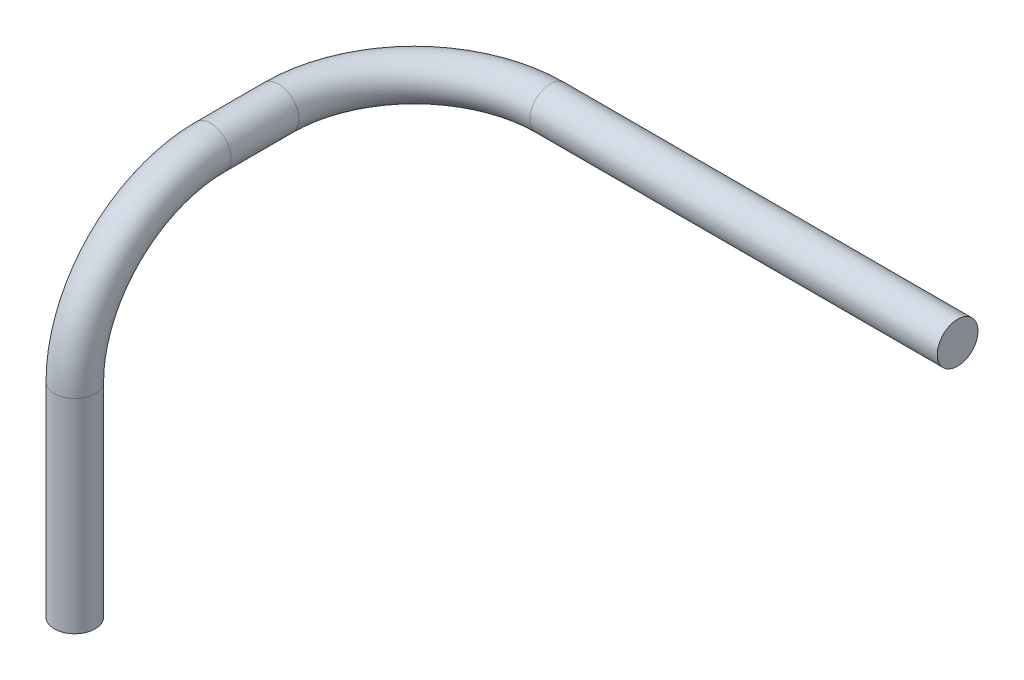
ISO-10303-21;
HEADER;
FILE_DESCRIPTION(('STEP AP214'),'2;1');
FILE_NAME('part.step','',(''),(''),'','','');
FILE_SCHEMA(('AUTOMOTIVE_DESIGN { 1 0 10303 214 1 1 1 1 }'));
ENDSEC;
DATA;
#1=APPLICATION_CONTEXT('core data for automotive mechanical design processes');
#2=APPLICATION_PROTOCOL_DEFINITION('international standard','automotive_design',2000,#1);
#3=PRODUCT_CONTEXT('',#1,'mechanical');
#4=PRODUCT('Part','Part','',(#3));
#5=PRODUCT_RELATED_PRODUCT_CATEGORY('part','',(#4));
#6=PRODUCT_DEFINITION_FORMATION('','',#4);
#7=PRODUCT_DEFINITION_CONTEXT('part definition',#1,'design');
#8=PRODUCT_DEFINITION('design','',#6,#7);
#9=PRODUCT_DEFINITION_SHAPE('','',#8);
#10=(LENGTH_UNIT() NAMED_UNIT(*) SI_UNIT(.MILLI.,.METRE.));
#11=(NAMED_UNIT(*) PLANE_ANGLE_UNIT() SI_UNIT($,.RADIAN.));
#12=(NAMED_UNIT(*) SI_UNIT($,.STERADIAN.) SOLID_ANGLE_UNIT());
#13=UNCERTAINTY_MEASURE_WITH_UNIT(LENGTH_MEASURE(1.E-05),#10,'distance_accuracy_value','');
#14=(GEOMETRIC_REPRESENTATION_CONTEXT(3) GLOBAL_UNCERTAINTY_ASSIGNED_CONTEXT((#13)) GLOBAL_UNIT_ASSIGNED_CONTEXT((#10,
#11,#12)) REPRESENTATION_CONTEXT('',''));
#15=CARTESIAN_POINT('',(0.,0.,0.));
#16=DIRECTION('',(0.,0.,1.));
#17=DIRECTION('',(1.,0.,0.));
#18=AXIS2_PLACEMENT_3D('',#15,#16,#17);
#19=CARTESIAN_POINT('',(0.,0.,0.));
#20=DIRECTION('',(0.,-1.,0.));
#21=DIRECTION('',(1.,0.,0.));
#22=AXIS2_PLACEMENT_3D('',#19,#20,#21);
#23=PLANE('',#22);
#24=CARTESIAN_POINT('',(0.,0.,0.));
#25=DIRECTION('',(0.,-1.,0.));
#26=DIRECTION('',(1.,0.,0.));
#27=AXIS2_PLACEMENT_3D('',#24,#25,#26);
#28=CIRCLE('',#27,1.5);
#29=CARTESIAN_POINT('',(1.5,0.,0.));
#30=VERTEX_POINT('',#29);
#31=EDGE_CURVE('E57',#30,#30,#28,.T.);
#32=ORIENTED_EDGE('',*,*,#31,.T.);
#33=EDGE_LOOP('',(#32));
#34=FACE_BOUND('',#33,.T.);
#35=ADVANCED_FACE('F45',(#34),#23,.T.);
#36=CARTESIAN_POINT('',(40.,25.,-25.));
#37=DIRECTION('',(-1.,0.,0.));
#38=DIRECTION('',(0.,0.,1.));
#39=AXIS2_PLACEMENT_3D('',#36,#37,#38);
#40=PLANE('',#39);
#41=CARTESIAN_POINT('',(40.,25.,-25.));
#42=DIRECTION('',(-1.,0.,0.));
#43=DIRECTION('',(0.,0.,1.));
#44=AXIS2_PLACEMENT_3D('',#41,#42,#43);
#45=CIRCLE('',#44,1.5);
#46=CARTESIAN_POINT('',(40.,25.,-23.5));
#47=VERTEX_POINT('',#46);
#48=EDGE_CURVE('E12',#47,#47,#45,.T.);
#49=ORIENTED_EDGE('',*,*,#48,.F.);
#50=EDGE_LOOP('',(#49));
#51=FACE_BOUND('',#50,.T.);
#52=ADVANCED_FACE('F63',(#51),#40,.F.);
#53=CARTESIAN_POINT('',(0.,0.,0.));
#54=DIRECTION('',(0.,1.,0.));
#55=DIRECTION('',(0.,0.,1.));
#56=AXIS2_PLACEMENT_3D('',#53,#54,#55);
#57=CYLINDRICAL_SURFACE('',#56,1.5);
#58=CARTESIAN_POINT('',(0.,15.,0.));
#59=DIRECTION('',(0.,-1.,0.));
#60=DIRECTION('',(1.,0.,0.));
#61=AXIS2_PLACEMENT_3D('',#58,#59,#60);
#62=CIRCLE('',#61,1.5);
#63=CARTESIAN_POINT('',(0.,15.,1.5));
#64=VERTEX_POINT('',#63);
#65=EDGE_CURVE('E97',#64,#64,#62,.T.);
#66=ORIENTED_EDGE('',*,*,#65,.T.);
#67=EDGE_LOOP('',(#66));
#68=FACE_BOUND('',#67,.T.);
#69=ORIENTED_EDGE('',*,*,#31,.F.);
#70=EDGE_LOOP('',(#69));
#71=FACE_BOUND('',#70,.T.);
#72=ADVANCED_FACE('F65',(#68,#71),#57,.T.);
#73=CARTESIAN_POINT('',(0.,15.,-10.));
#74=DIRECTION('',(-1.,0.,0.));
#75=DIRECTION('',(0.,0.,1.));
#76=AXIS2_PLACEMENT_3D('',#73,#74,#75);
#77=TOROIDAL_SURFACE('',#76,10.,1.5);
#78=CARTESIAN_POINT('',(0.,25.,-10.));
#79=DIRECTION('',(0.,0.,1.));
#80=DIRECTION('',(1.,0.,0.));
#81=AXIS2_PLACEMENT_3D('',#78,#79,#80);
#82=CIRCLE('',#81,1.5);
#83=CARTESIAN_POINT('',(0.,26.5,-10.));
#84=VERTEX_POINT('',#83);
#85=EDGE_CURVE('E94',#84,#84,#82,.T.);
#86=CARTESIAN_POINT('',(0.,15.,-10.));
#87=DIRECTION('',(-1.,0.,0.));
#88=DIRECTION('',(0.,0.,1.));
#89=AXIS2_PLACEMENT_3D('',#86,#87,#88);
#90=CIRCLE('',#89,11.5);
#91=EDGE_CURVE('',#64,#84,#90,.T.);
#92=ORIENTED_EDGE('',*,*,#65,.F.);
#93=ORIENTED_EDGE('',*,*,#85,.T.);
#94=ORIENTED_EDGE('',*,*,#91,.T.);
#95=ORIENTED_EDGE('',*,*,#91,.F.);
#96=EDGE_LOOP('',(#92,#94,#93,#95));
#97=FACE_BOUND('',#96,.T.);
#98=ADVANCED_FACE('F70',(#97),#77,.T.);
#99=CARTESIAN_POINT('',(0.,25.,-10.));
#100=DIRECTION('',(0.,0.,-1.));
#101=DIRECTION('',(-1.,0.,0.));
#102=AXIS2_PLACEMENT_3D('',#99,#100,#101);
#103=CYLINDRICAL_SURFACE('',#102,1.5);
#104=CARTESIAN_POINT('',(0.,25.,-15.));
#105=DIRECTION('',(0.,0.,1.));
#106=DIRECTION('',(1.,0.,0.));
#107=AXIS2_PLACEMENT_3D('',#104,#105,#106);
#108=CIRCLE('',#107,1.5);
#109=CARTESIAN_POINT('',(-1.5,25.,-15.));
#110=VERTEX_POINT('',#109);
#111=EDGE_CURVE('E99',#110,#110,#108,.T.);
#112=ORIENTED_EDGE('',*,*,#111,.T.);
#113=EDGE_LOOP('',(#112));
#114=FACE_BOUND('',#113,.T.);
#115=ORIENTED_EDGE('',*,*,#85,.F.);
#116=EDGE_LOOP('',(#115));
#117=FACE_BOUND('',#116,.T.);
#118=ADVANCED_FACE('F80',(#114,#117),#103,.T.);
#119=CARTESIAN_POINT('',(10.,25.,-15.));
#120=DIRECTION('',(0.,-1.,0.));
#121=DIRECTION('',(0.,0.,-1.));
#122=AXIS2_PLACEMENT_3D('',#119,#120,#121);
#123=TOROIDAL_SURFACE('',#122,10.,1.5);
#124=CARTESIAN_POINT('',(10.,25.,-25.));
#125=DIRECTION('',(-1.,0.,0.));
#126=DIRECTION('',(0.,0.,1.));
#127=AXIS2_PLACEMENT_3D('',#124,#125,#126);
#128=CIRCLE('',#127,1.5);
#129=CARTESIAN_POINT('',(10.,25.,-26.5));
#130=VERTEX_POINT('',#129);
#131=EDGE_CURVE('E52',#130,#130,#128,.T.);
#132=CARTESIAN_POINT('',(10.,25.,-15.));
#133=DIRECTION('',(0.,-1.,0.));
#134=DIRECTION('',(0.,0.,-1.));
#135=AXIS2_PLACEMENT_3D('',#132,#133,#134);
#136=CIRCLE('',#135,11.5);
#137=EDGE_CURVE('',#110,#130,#136,.T.);
#138=ORIENTED_EDGE('',*,*,#111,.F.);
#139=ORIENTED_EDGE('',*,*,#131,.T.);
#140=ORIENTED_EDGE('',*,*,#137,.T.);
#141=ORIENTED_EDGE('',*,*,#137,.F.);
#142=EDGE_LOOP('',(#138,#140,#139,#141));
#143=FACE_BOUND('',#142,.T.);
#144=ADVANCED_FACE('F76',(#143),#123,.T.);
#145=CARTESIAN_POINT('',(10.,25.,-25.));
#146=DIRECTION('',(1.,0.,0.));
#147=DIRECTION('',(0.,0.,-1.));
#148=AXIS2_PLACEMENT_3D('',#145,#146,#147);
#149=CYLINDRICAL_SURFACE('',#148,1.5);
#150=ORIENTED_EDGE('',*,*,#48,.T.);
#151=EDGE_LOOP('',(#150));
#152=FACE_BOUND('',#151,.T.);
#153=ORIENTED_EDGE('',*,*,#131,.F.);
#154=EDGE_LOOP('',(#153));
#155=FACE_BOUND('',#154,.T.);
#156=ADVANCED_FACE('F60',(#152,#155),#149,.T.);
#157=CLOSED_SHELL('',(#35,#52,#72,#98,#118,#144,#156));
#158=MANIFOLD_SOLID_BREP('B2',#157);
#159=ADVANCED_BREP_SHAPE_REPRESENTATION('',(#18,#158),#14);
#160=SHAPE_DEFINITION_REPRESENTATION(#9,#159);
ENDSEC;
END-ISO-10303-21;
